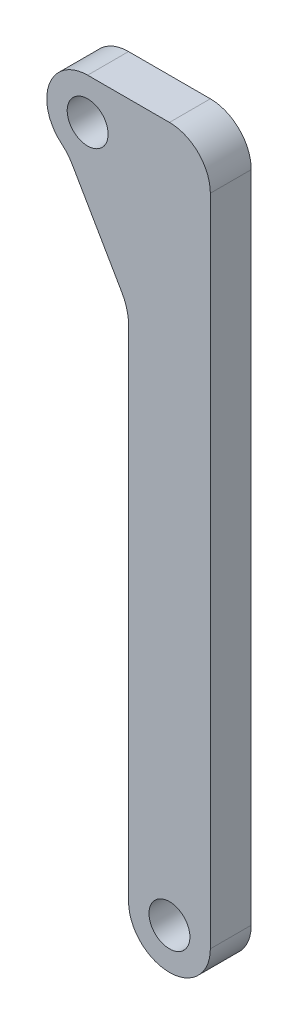
ISO-10303-21;
HEADER;
FILE_DESCRIPTION(('STEP AP214'),'2;1');
FILE_NAME('part.step','',(''),(''),'','','');
FILE_SCHEMA(('AUTOMOTIVE_DESIGN { 1 0 10303 214 1 1 1 1 }'));
ENDSEC;
DATA;
#1=APPLICATION_CONTEXT('core data for automotive mechanical design processes');
#2=APPLICATION_PROTOCOL_DEFINITION('international standard','automotive_design',2000,#1);
#3=PRODUCT_CONTEXT('',#1,'mechanical');
#4=PRODUCT('Part','Part','',(#3));
#5=PRODUCT_RELATED_PRODUCT_CATEGORY('part','',(#4));
#6=PRODUCT_DEFINITION_FORMATION('','',#4);
#7=PRODUCT_DEFINITION_CONTEXT('part definition',#1,'design');
#8=PRODUCT_DEFINITION('design','',#6,#7);
#9=PRODUCT_DEFINITION_SHAPE('','',#8);
#10=(LENGTH_UNIT() NAMED_UNIT(*) SI_UNIT(.MILLI.,.METRE.));
#11=(NAMED_UNIT(*) PLANE_ANGLE_UNIT() SI_UNIT($,.RADIAN.));
#12=(NAMED_UNIT(*) SI_UNIT($,.STERADIAN.) SOLID_ANGLE_UNIT());
#13=UNCERTAINTY_MEASURE_WITH_UNIT(LENGTH_MEASURE(1.E-05),#10,'distance_accuracy_value','');
#14=(GEOMETRIC_REPRESENTATION_CONTEXT(3) GLOBAL_UNCERTAINTY_ASSIGNED_CONTEXT((#13)) GLOBAL_UNIT_ASSIGNED_CONTEXT((#10,
#11,#12)) REPRESENTATION_CONTEXT('',''));
#15=CARTESIAN_POINT('',(0.,0.,0.));
#16=DIRECTION('',(0.,0.,1.));
#17=DIRECTION('',(1.,0.,0.));
#18=AXIS2_PLACEMENT_3D('',#15,#16,#17);
#19=CARTESIAN_POINT('',(-6.35,0.,6.35));
#20=DIRECTION('',(-1.,0.,0.));
#21=DIRECTION('',(0.,-1.,0.));
#22=AXIS2_PLACEMENT_3D('',#19,#20,#21);
#23=PLANE('',#22);
#24=DIRECTION('',(0.,1.,0.));
#25=VECTOR('',#24,1.);
#26=CARTESIAN_POINT('',(-6.35,0.,6.35));
#27=LINE('',#26,#25);
#28=CARTESIAN_POINT('',(-6.35,0.,6.35));
#29=VERTEX_POINT('',#28);
#30=CARTESIAN_POINT('',(-6.35,77.5611818975498,6.35));
#31=VERTEX_POINT('',#30);
#32=EDGE_CURVE('E109',#29,#31,#27,.T.);
#33=ORIENTED_EDGE('',*,*,#32,.T.);
#34=DIRECTION('',(0.,0.,-1.));
#35=VECTOR('',#34,1.);
#36=CARTESIAN_POINT('',(-6.35,77.5611818975498,6.35));
#37=LINE('',#36,#35);
#38=CARTESIAN_POINT('',(-6.35,77.5611818975498,0.));
#39=VERTEX_POINT('',#38);
#40=EDGE_CURVE('E179',#31,#39,#37,.T.);
#41=ORIENTED_EDGE('',*,*,#40,.T.);
#42=DIRECTION('',(0.,1.,0.));
#43=VECTOR('',#42,1.);
#44=CARTESIAN_POINT('',(-6.35,0.,0.));
#45=LINE('',#44,#43);
#46=CARTESIAN_POINT('',(-6.35,0.,0.));
#47=VERTEX_POINT('',#46);
#48=EDGE_CURVE('E112',#47,#39,#45,.T.);
#49=ORIENTED_EDGE('',*,*,#48,.F.);
#50=DIRECTION('',(0.,0.,-1.));
#51=VECTOR('',#50,1.);
#52=CARTESIAN_POINT('',(-6.35,0.,6.35));
#53=LINE('',#52,#51);
#54=EDGE_CURVE('E105',#29,#47,#53,.T.);
#55=ORIENTED_EDGE('',*,*,#54,.F.);
#56=EDGE_LOOP('',(#33,#41,#49,#55));
#57=FACE_BOUND('',#56,.T.);
#58=ADVANCED_FACE('F34',(#57),#23,.T.);
#59=CARTESIAN_POINT('',(0.,0.,6.35));
#60=DIRECTION('',(0.,0.,-1.));
#61=DIRECTION('',(-1.,0.,0.));
#62=AXIS2_PLACEMENT_3D('',#59,#60,#61);
#63=CYLINDRICAL_SURFACE('',#62,6.35);
#64=CARTESIAN_POINT('',(0.,0.,0.));
#65=DIRECTION('',(0.,0.,1.));
#66=DIRECTION('',(1.,0.,0.));
#67=AXIS2_PLACEMENT_3D('',#64,#65,#66);
#68=CIRCLE('',#67,6.35);
#69=CARTESIAN_POINT('',(6.35,0.,0.));
#70=VERTEX_POINT('',#69);
#71=EDGE_CURVE('E156',#47,#70,#68,.T.);
#72=ORIENTED_EDGE('',*,*,#71,.T.);
#73=DIRECTION('',(0.,0.,-1.));
#74=VECTOR('',#73,1.);
#75=CARTESIAN_POINT('',(6.35,0.,6.35));
#76=LINE('',#75,#74);
#77=CARTESIAN_POINT('',(6.35,0.,6.35));
#78=VERTEX_POINT('',#77);
#79=EDGE_CURVE('E117',#78,#70,#76,.T.);
#80=ORIENTED_EDGE('',*,*,#79,.F.);
#81=CARTESIAN_POINT('',(0.,0.,6.35));
#82=DIRECTION('',(0.,0.,1.));
#83=DIRECTION('',(1.,0.,0.));
#84=AXIS2_PLACEMENT_3D('',#81,#82,#83);
#85=CIRCLE('',#84,6.35);
#86=EDGE_CURVE('E121',#29,#78,#85,.T.);
#87=ORIENTED_EDGE('',*,*,#86,.F.);
#88=ORIENTED_EDGE('',*,*,#54,.T.);
#89=EDGE_LOOP('',(#72,#80,#87,#88));
#90=FACE_BOUND('',#89,.T.);
#91=ADVANCED_FACE('F122',(#90),#63,.T.);
#92=CARTESIAN_POINT('',(6.35,0.,6.35));
#93=DIRECTION('',(-1.,0.,0.));
#94=DIRECTION('',(0.,-1.,0.));
#95=AXIS2_PLACEMENT_3D('',#92,#93,#94);
#96=PLANE('',#95);
#97=DIRECTION('',(0.,1.,0.));
#98=VECTOR('',#97,1.);
#99=CARTESIAN_POINT('',(6.35,0.,0.));
#100=LINE('',#99,#98);
#101=CARTESIAN_POINT('',(6.35,101.6,0.));
#102=VERTEX_POINT('',#101);
#103=EDGE_CURVE('E158',#70,#102,#100,.T.);
#104=ORIENTED_EDGE('',*,*,#103,.T.);
#105=DIRECTION('',(0.,0.,-1.));
#106=VECTOR('',#105,1.);
#107=CARTESIAN_POINT('',(6.35,101.6,6.35));
#108=LINE('',#107,#106);
#109=CARTESIAN_POINT('',(6.35,101.6,6.35));
#110=VERTEX_POINT('',#109);
#111=EDGE_CURVE('E172',#110,#102,#108,.T.);
#112=ORIENTED_EDGE('',*,*,#111,.F.);
#113=DIRECTION('',(0.,1.,0.));
#114=VECTOR('',#113,1.);
#115=CARTESIAN_POINT('',(6.35,0.,6.35));
#116=LINE('',#115,#114);
#117=EDGE_CURVE('E126',#78,#110,#116,.T.);
#118=ORIENTED_EDGE('',*,*,#117,.F.);
#119=ORIENTED_EDGE('',*,*,#79,.T.);
#120=EDGE_LOOP('',(#104,#112,#118,#119));
#121=FACE_BOUND('',#120,.T.);
#122=ADVANCED_FACE('F207',(#121),#96,.F.);
#123=CARTESIAN_POINT('',(0.,101.6,6.35));
#124=DIRECTION('',(0.,0.,-1.));
#125=DIRECTION('',(-1.,0.,0.));
#126=AXIS2_PLACEMENT_3D('',#123,#124,#125);
#127=CYLINDRICAL_SURFACE('',#126,6.35);
#128=CARTESIAN_POINT('',(0.,101.6,0.));
#129=DIRECTION('',(0.,0.,1.));
#130=DIRECTION('',(1.,0.,0.));
#131=AXIS2_PLACEMENT_3D('',#128,#129,#130);
#132=CIRCLE('',#131,6.35);
#133=CARTESIAN_POINT('',(0.,107.95,0.));
#134=VERTEX_POINT('',#133);
#135=EDGE_CURVE('E161',#102,#134,#132,.T.);
#136=ORIENTED_EDGE('',*,*,#135,.T.);
#137=DIRECTION('',(0.,0.,-1.));
#138=VECTOR('',#137,1.);
#139=CARTESIAN_POINT('',(0.,107.95,6.35));
#140=LINE('',#139,#138);
#141=CARTESIAN_POINT('',(0.,107.95,6.35));
#142=VERTEX_POINT('',#141);
#143=EDGE_CURVE('E170',#142,#134,#140,.T.);
#144=ORIENTED_EDGE('',*,*,#143,.F.);
#145=CARTESIAN_POINT('',(0.,101.6,6.35));
#146=DIRECTION('',(0.,0.,1.));
#147=DIRECTION('',(1.,0.,0.));
#148=AXIS2_PLACEMENT_3D('',#145,#146,#147);
#149=CIRCLE('',#148,6.35);
#150=EDGE_CURVE('E140',#110,#142,#149,.T.);
#151=ORIENTED_EDGE('',*,*,#150,.F.);
#152=ORIENTED_EDGE('',*,*,#111,.T.);
#153=EDGE_LOOP('',(#136,#144,#151,#152));
#154=FACE_BOUND('',#153,.T.);
#155=ADVANCED_FACE('F204',(#154),#127,.T.);
#156=CARTESIAN_POINT('',(0.,107.95,6.35));
#157=DIRECTION('',(0.,1.,0.));
#158=DIRECTION('',(0.,0.,1.));
#159=AXIS2_PLACEMENT_3D('',#156,#157,#158);
#160=PLANE('',#159);
#161=DIRECTION('',(1.,0.,0.));
#162=VECTOR('',#161,1.);
#163=CARTESIAN_POINT('',(0.,107.95,0.));
#164=LINE('',#163,#162);
#165=CARTESIAN_POINT('',(-12.7,107.95,0.));
#166=VERTEX_POINT('',#165);
#167=EDGE_CURVE('E164',#166,#134,#164,.T.);
#168=ORIENTED_EDGE('',*,*,#167,.F.);
#169=DIRECTION('',(0.,0.,-1.));
#170=VECTOR('',#169,1.);
#171=CARTESIAN_POINT('',(-12.7,107.95,6.35));
#172=LINE('',#171,#170);
#173=CARTESIAN_POINT('',(-12.7,107.95,6.35));
#174=VERTEX_POINT('',#173);
#175=EDGE_CURVE('E148',#174,#166,#172,.T.);
#176=ORIENTED_EDGE('',*,*,#175,.F.);
#177=DIRECTION('',(1.,0.,0.));
#178=VECTOR('',#177,1.);
#179=CARTESIAN_POINT('',(0.,107.95,6.35));
#180=LINE('',#179,#178);
#181=EDGE_CURVE('E142',#174,#142,#180,.T.);
#182=ORIENTED_EDGE('',*,*,#181,.T.);
#183=ORIENTED_EDGE('',*,*,#143,.T.);
#184=EDGE_LOOP('',(#168,#176,#182,#183));
#185=FACE_BOUND('',#184,.T.);
#186=ADVANCED_FACE('F201',(#185),#160,.T.);
#187=CARTESIAN_POINT('',(-12.7,101.6,6.35));
#188=DIRECTION('',(0.,0.,-1.));
#189=DIRECTION('',(-1.,0.,0.));
#190=AXIS2_PLACEMENT_3D('',#187,#188,#189);
#191=CYLINDRICAL_SURFACE('',#190,6.34999999999999);
#192=CARTESIAN_POINT('',(-12.7,101.6,0.));
#193=DIRECTION('',(0.,0.,1.));
#194=DIRECTION('',(1.,0.,0.));
#195=AXIS2_PLACEMENT_3D('',#192,#193,#194);
#196=CIRCLE('',#195,6.34999999999999);
#197=CARTESIAN_POINT('',(-16.7733214601456,96.7285985299591,0.));
#198=VERTEX_POINT('',#197);
#199=EDGE_CURVE('E167',#166,#198,#196,.T.);
#200=ORIENTED_EDGE('',*,*,#199,.T.);
#201=DIRECTION('',(0.,0.,-1.));
#202=VECTOR('',#201,1.);
#203=CARTESIAN_POINT('',(-16.7733214601456,96.7285985299591,6.35));
#204=LINE('',#203,#202);
#205=CARTESIAN_POINT('',(-16.7733214601456,96.7285985299591,6.35));
#206=VERTEX_POINT('',#205);
#207=EDGE_CURVE('E185',#198,#206,#204,.F.);
#208=ORIENTED_EDGE('',*,*,#207,.T.);
#209=CARTESIAN_POINT('',(-12.7,101.6,6.35));
#210=DIRECTION('',(0.,0.,1.));
#211=DIRECTION('',(1.,0.,0.));
#212=AXIS2_PLACEMENT_3D('',#209,#210,#211);
#213=CIRCLE('',#212,6.34999999999999);
#214=EDGE_CURVE('E145',#174,#206,#213,.T.);
#215=ORIENTED_EDGE('',*,*,#214,.F.);
#216=ORIENTED_EDGE('',*,*,#175,.T.);
#217=EDGE_LOOP('',(#200,#208,#215,#216));
#218=FACE_BOUND('',#217,.T.);
#219=ADVANCED_FACE('F197',(#218),#191,.T.);
#220=CARTESIAN_POINT('',(-12.7,101.6,6.35));
#221=DIRECTION('',(0.,0.,-1.));
#222=DIRECTION('',(-1.,0.,0.));
#223=AXIS2_PLACEMENT_3D('',#220,#221,#222);
#224=CYLINDRICAL_SURFACE('',#223,3.175);
#225=CARTESIAN_POINT('',(-12.7,101.6,6.35));
#226=DIRECTION('',(0.,0.,1.));
#227=DIRECTION('',(1.,0.,0.));
#228=AXIS2_PLACEMENT_3D('',#225,#226,#227);
#229=CIRCLE('',#228,3.175);
#230=CARTESIAN_POINT('',(-9.52500000000001,101.6,6.35));
#231=VERTEX_POINT('',#230);
#232=EDGE_CURVE('E132',#231,#231,#229,.T.);
#233=ORIENTED_EDGE('',*,*,#232,.T.);
#234=EDGE_LOOP('',(#233));
#235=FACE_BOUND('',#234,.T.);
#236=CARTESIAN_POINT('',(-12.7,101.6,0.));
#237=DIRECTION('',(0.,0.,1.));
#238=DIRECTION('',(1.,0.,0.));
#239=AXIS2_PLACEMENT_3D('',#236,#237,#238);
#240=CIRCLE('',#239,3.175);
#241=CARTESIAN_POINT('',(-9.52500000000001,101.6,0.));
#242=VERTEX_POINT('',#241);
#243=EDGE_CURVE('E152',#242,#242,#240,.T.);
#244=ORIENTED_EDGE('',*,*,#243,.F.);
#245=EDGE_LOOP('',(#244));
#246=FACE_BOUND('',#245,.T.);
#247=ADVANCED_FACE('F221',(#235,#246),#224,.F.);
#248=CARTESIAN_POINT('',(0.,0.,6.35));
#249=DIRECTION('',(0.,0.,-1.));
#250=DIRECTION('',(-1.,0.,0.));
#251=AXIS2_PLACEMENT_3D('',#248,#249,#250);
#252=CYLINDRICAL_SURFACE('',#251,3.175);
#253=CARTESIAN_POINT('',(0.,0.,6.35));
#254=DIRECTION('',(0.,0.,1.));
#255=DIRECTION('',(1.,0.,0.));
#256=AXIS2_PLACEMENT_3D('',#253,#254,#255);
#257=CIRCLE('',#256,3.175);
#258=CARTESIAN_POINT('',(3.175,0.,6.35));
#259=VERTEX_POINT('',#258);
#260=EDGE_CURVE('E135',#259,#259,#257,.T.);
#261=ORIENTED_EDGE('',*,*,#260,.T.);
#262=EDGE_LOOP('',(#261));
#263=FACE_BOUND('',#262,.T.);
#264=CARTESIAN_POINT('',(0.,0.,0.));
#265=DIRECTION('',(0.,0.,1.));
#266=DIRECTION('',(1.,0.,0.));
#267=AXIS2_PLACEMENT_3D('',#264,#265,#266);
#268=CIRCLE('',#267,3.175);
#269=CARTESIAN_POINT('',(3.175,0.,0.));
#270=VERTEX_POINT('',#269);
#271=EDGE_CURVE('E149',#270,#270,#268,.T.);
#272=ORIENTED_EDGE('',*,*,#271,.F.);
#273=EDGE_LOOP('',(#272));
#274=FACE_BOUND('',#273,.T.);
#275=ADVANCED_FACE('F224',(#263,#274),#252,.F.);
#276=CARTESIAN_POINT('',(0.,0.,6.35));
#277=DIRECTION('',(0.,0.,1.));
#278=DIRECTION('',(1.,0.,0.));
#279=AXIS2_PLACEMENT_3D('',#276,#277,#278);
#280=PLANE('',#279);
#281=ORIENTED_EDGE('',*,*,#260,.F.);
#282=EDGE_LOOP('',(#281));
#283=FACE_BOUND('',#282,.T.);
#284=ORIENTED_EDGE('',*,*,#232,.F.);
#285=EDGE_LOOP('',(#284));
#286=FACE_BOUND('',#285,.T.);
#287=ORIENTED_EDGE('',*,*,#32,.F.);
#288=ORIENTED_EDGE('',*,*,#86,.T.);
#289=ORIENTED_EDGE('',*,*,#117,.T.);
#290=ORIENTED_EDGE('',*,*,#150,.T.);
#291=ORIENTED_EDGE('',*,*,#181,.F.);
#292=ORIENTED_EDGE('',*,*,#214,.T.);
#293=CARTESIAN_POINT('',(-21.6613072123204,90.8829167659099,6.35));
#294=DIRECTION('',(0.,0.,1.));
#295=DIRECTION('',(1.,0.,0.));
#296=AXIS2_PLACEMENT_3D('',#293,#294,#295);
#297=CIRCLE('',#296,7.62);
#298=CARTESIAN_POINT('',(-15.0621936354829,94.6929167659099,6.35));
#299=VERTEX_POINT('',#298);
#300=EDGE_CURVE('E42',#206,#299,#297,.F.);
#301=ORIENTED_EDGE('',*,*,#300,.T.);
#302=DIRECTION('',(0.499999999999992,-0.866025403784443,0.));
#303=VECTOR('',#302,1.);
#304=CARTESIAN_POINT('',(-6.35,79.6029547438749,6.35));
#305=LINE('',#304,#303);
#306=CARTESIAN_POINT('',(-7.37088642316253,81.3711818975497,6.35));
#307=VERTEX_POINT('',#306);
#308=EDGE_CURVE('E177',#299,#307,#305,.T.);
#309=ORIENTED_EDGE('',*,*,#308,.T.);
#310=CARTESIAN_POINT('',(-13.97,77.5611818975498,6.35));
#311=DIRECTION('',(0.,0.,1.));
#312=DIRECTION('',(1.,0.,0.));
#313=AXIS2_PLACEMENT_3D('',#310,#311,#312);
#314=CIRCLE('',#313,7.62);
#315=EDGE_CURVE('E131',#307,#31,#314,.F.);
#316=ORIENTED_EDGE('',*,*,#315,.T.);
#317=EDGE_LOOP('',(#287,#288,#289,#290,#291,#292,#301,#309,#316));
#318=FACE_BOUND('',#317,.T.);
#319=ADVANCED_FACE('F128',(#283,#286,#318),#280,.T.);
#320=CARTESIAN_POINT('',(0.,0.,0.));
#321=DIRECTION('',(0.,0.,1.));
#322=DIRECTION('',(1.,0.,0.));
#323=AXIS2_PLACEMENT_3D('',#320,#321,#322);
#324=PLANE('',#323);
#325=ORIENTED_EDGE('',*,*,#271,.T.);
#326=EDGE_LOOP('',(#325));
#327=FACE_BOUND('',#326,.T.);
#328=ORIENTED_EDGE('',*,*,#243,.T.);
#329=EDGE_LOOP('',(#328));
#330=FACE_BOUND('',#329,.T.);
#331=ORIENTED_EDGE('',*,*,#48,.T.);
#332=CARTESIAN_POINT('',(-13.97,77.5611818975498,0.));
#333=DIRECTION('',(0.,0.,1.));
#334=DIRECTION('',(1.,0.,0.));
#335=AXIS2_PLACEMENT_3D('',#332,#333,#334);
#336=CIRCLE('',#335,7.62);
#337=CARTESIAN_POINT('',(-7.37088642316253,81.3711818975497,0.));
#338=VERTEX_POINT('',#337);
#339=EDGE_CURVE('E187',#39,#338,#336,.T.);
#340=ORIENTED_EDGE('',*,*,#339,.T.);
#341=DIRECTION('',(-0.499999999999992,0.866025403784443,0.));
#342=VECTOR('',#341,1.);
#343=CARTESIAN_POINT('',(29.7065905122489,17.1511080289525,0.));
#344=LINE('',#343,#342);
#345=CARTESIAN_POINT('',(-15.0621936354829,94.6929167659099,0.));
#346=VERTEX_POINT('',#345);
#347=EDGE_CURVE('E116',#338,#346,#344,.T.);
#348=ORIENTED_EDGE('',*,*,#347,.T.);
#349=CARTESIAN_POINT('',(-21.6613072123204,90.8829167659099,0.));
#350=DIRECTION('',(0.,0.,1.));
#351=DIRECTION('',(1.,0.,0.));
#352=AXIS2_PLACEMENT_3D('',#349,#350,#351);
#353=CIRCLE('',#352,7.62);
#354=EDGE_CURVE('E11',#346,#198,#353,.T.);
#355=ORIENTED_EDGE('',*,*,#354,.T.);
#356=ORIENTED_EDGE('',*,*,#199,.F.);
#357=ORIENTED_EDGE('',*,*,#167,.T.);
#358=ORIENTED_EDGE('',*,*,#135,.F.);
#359=ORIENTED_EDGE('',*,*,#103,.F.);
#360=ORIENTED_EDGE('',*,*,#71,.F.);
#361=EDGE_LOOP('',(#331,#340,#348,#355,#356,#357,#358,#359,#360));
#362=FACE_BOUND('',#361,.T.);
#363=ADVANCED_FACE('F199',(#327,#330,#362),#324,.F.);
#364=CARTESIAN_POINT('',(-6.35,79.6029547438749,6.35));
#365=DIRECTION('',(0.866025403784443,0.499999999999992,0.));
#366=DIRECTION('',(0.,0.,-1.));
#367=AXIS2_PLACEMENT_3D('',#364,#365,#366);
#368=PLANE('',#367);
#369=ORIENTED_EDGE('',*,*,#347,.F.);
#370=DIRECTION('',(0.,0.,-1.));
#371=VECTOR('',#370,1.);
#372=CARTESIAN_POINT('',(-7.37088642316253,81.3711818975497,6.35));
#373=LINE('',#372,#371);
#374=EDGE_CURVE('E183',#338,#307,#373,.F.);
#375=ORIENTED_EDGE('',*,*,#374,.T.);
#376=ORIENTED_EDGE('',*,*,#308,.F.);
#377=DIRECTION('',(0.,0.,1.));
#378=VECTOR('',#377,1.);
#379=CARTESIAN_POINT('',(-15.0621936354829,94.6929167659099,0.));
#380=LINE('',#379,#378);
#381=EDGE_CURVE('E181',#299,#346,#380,.F.);
#382=ORIENTED_EDGE('',*,*,#381,.T.);
#383=EDGE_LOOP('',(#369,#375,#376,#382));
#384=FACE_BOUND('',#383,.T.);
#385=ADVANCED_FACE('F194',(#384),#368,.F.);
#386=CARTESIAN_POINT('',(-13.97,77.5611818975498,6.35));
#387=DIRECTION('',(0.,0.,-1.));
#388=DIRECTION('',(-1.,0.,0.));
#389=AXIS2_PLACEMENT_3D('',#386,#387,#388);
#390=CYLINDRICAL_SURFACE('',#389,7.62);
#391=ORIENTED_EDGE('',*,*,#315,.F.);
#392=ORIENTED_EDGE('',*,*,#374,.F.);
#393=ORIENTED_EDGE('',*,*,#339,.F.);
#394=ORIENTED_EDGE('',*,*,#40,.F.);
#395=EDGE_LOOP('',(#391,#392,#393,#394));
#396=FACE_BOUND('',#395,.T.);
#397=ADVANCED_FACE('F230',(#396),#390,.F.);
#398=CARTESIAN_POINT('',(-21.6613072123204,90.8829167659099,6.35));
#399=DIRECTION('',(0.,0.,-1.));
#400=DIRECTION('',(-1.,0.,0.));
#401=AXIS2_PLACEMENT_3D('',#398,#399,#400);
#402=CYLINDRICAL_SURFACE('',#401,7.62);
#403=ORIENTED_EDGE('',*,*,#354,.F.);
#404=ORIENTED_EDGE('',*,*,#381,.F.);
#405=ORIENTED_EDGE('',*,*,#300,.F.);
#406=ORIENTED_EDGE('',*,*,#207,.F.);
#407=EDGE_LOOP('',(#403,#404,#405,#406));
#408=FACE_BOUND('',#407,.T.);
#409=ADVANCED_FACE('F36',(#408),#402,.F.);
#410=CLOSED_SHELL('',(#58,#91,#122,#155,#186,#219,#247,#275,#319,#363,#385,#397,#409));
#411=MANIFOLD_SOLID_BREP('B2',#410);
#412=ADVANCED_BREP_SHAPE_REPRESENTATION('',(#18,#411),#14);
#413=SHAPE_DEFINITION_REPRESENTATION(#9,#412);
ENDSEC;
END-ISO-10303-21;
